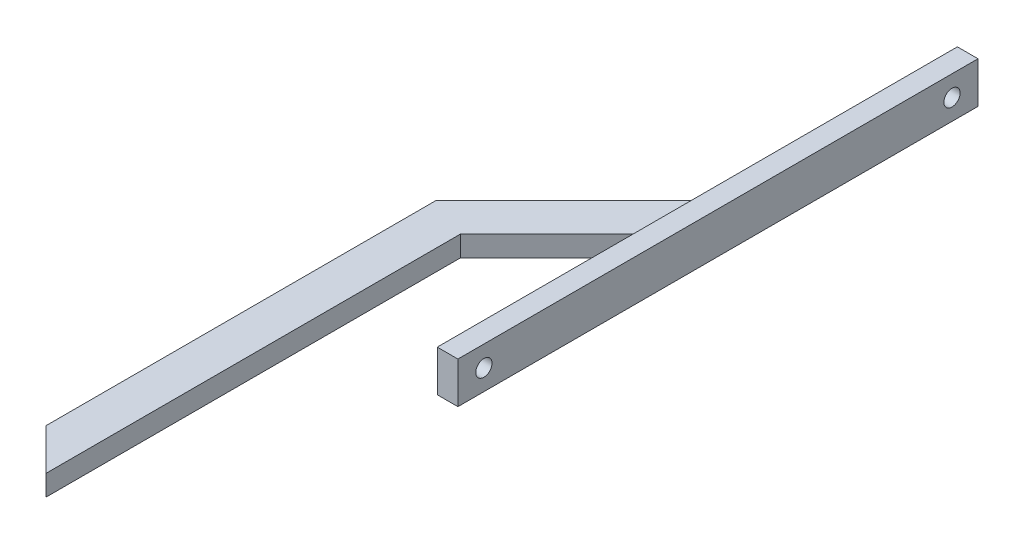
ISO-10303-21;
HEADER;
FILE_DESCRIPTION(('STEP AP214'),'2;1');
FILE_NAME('part.step','',(''),(''),'','','');
FILE_SCHEMA(('AUTOMOTIVE_DESIGN { 1 0 10303 214 1 1 1 1 }'));
ENDSEC;
DATA;
#1=APPLICATION_CONTEXT('core data for automotive mechanical design processes');
#2=APPLICATION_PROTOCOL_DEFINITION('international standard','automotive_design',2000,#1);
#3=PRODUCT_CONTEXT('',#1,'mechanical');
#4=PRODUCT('Part','Part','',(#3));
#5=PRODUCT_RELATED_PRODUCT_CATEGORY('part','',(#4));
#6=PRODUCT_DEFINITION_FORMATION('','',#4);
#7=PRODUCT_DEFINITION_CONTEXT('part definition',#1,'design');
#8=PRODUCT_DEFINITION('design','',#6,#7);
#9=PRODUCT_DEFINITION_SHAPE('','',#8);
#10=(LENGTH_UNIT() NAMED_UNIT(*) SI_UNIT(.MILLI.,.METRE.));
#11=(NAMED_UNIT(*) PLANE_ANGLE_UNIT() SI_UNIT($,.RADIAN.));
#12=(NAMED_UNIT(*) SI_UNIT($,.STERADIAN.) SOLID_ANGLE_UNIT());
#13=UNCERTAINTY_MEASURE_WITH_UNIT(LENGTH_MEASURE(1.E-05),#10,'distance_accuracy_value','');
#14=(GEOMETRIC_REPRESENTATION_CONTEXT(3) GLOBAL_UNCERTAINTY_ASSIGNED_CONTEXT((#13)) GLOBAL_UNIT_ASSIGNED_CONTEXT((#10,
#11,#12)) REPRESENTATION_CONTEXT('',''));
#15=CARTESIAN_POINT('',(0.,0.,0.));
#16=DIRECTION('',(0.,0.,1.));
#17=DIRECTION('',(1.,0.,0.));
#18=AXIS2_PLACEMENT_3D('',#15,#16,#17);
#19=CARTESIAN_POINT('',(3.175,-6.35,-80.));
#20=DIRECTION('',(1.,0.,0.));
#21=DIRECTION('',(0.,0.,-1.));
#22=AXIS2_PLACEMENT_3D('',#19,#20,#21);
#23=PLANE('',#22);
#24=CARTESIAN_POINT('',(3.175,0.,72.));
#25=DIRECTION('',(1.,0.,0.));
#26=DIRECTION('',(0.,0.,-1.));
#27=AXIS2_PLACEMENT_3D('',#24,#25,#26);
#28=CIRCLE('',#27,2.5);
#29=CARTESIAN_POINT('',(3.175,0.,69.5));
#30=VERTEX_POINT('',#29);
#31=EDGE_CURVE('E156',#30,#30,#28,.T.);
#32=ORIENTED_EDGE('',*,*,#31,.F.);
#33=EDGE_LOOP('',(#32));
#34=FACE_BOUND('',#33,.T.);
#35=CARTESIAN_POINT('',(3.175,0.,-72.));
#36=DIRECTION('',(1.,0.,0.));
#37=DIRECTION('',(0.,0.,1.));
#38=AXIS2_PLACEMENT_3D('',#35,#36,#37);
#39=CIRCLE('',#38,2.5);
#40=CARTESIAN_POINT('',(3.175,0.,-69.5));
#41=VERTEX_POINT('',#40);
#42=EDGE_CURVE('E164',#41,#41,#39,.T.);
#43=ORIENTED_EDGE('',*,*,#42,.F.);
#44=EDGE_LOOP('',(#43));
#45=FACE_BOUND('',#44,.T.);
#46=DIRECTION('',(0.,0.,1.));
#47=VECTOR('',#46,1.);
#48=CARTESIAN_POINT('',(3.175,6.35,-80.));
#49=LINE('',#48,#47);
#50=CARTESIAN_POINT('',(3.175,6.35,-80.));
#51=VERTEX_POINT('',#50);
#52=CARTESIAN_POINT('',(3.175,6.35,80.));
#53=VERTEX_POINT('',#52);
#54=EDGE_CURVE('E199',#51,#53,#49,.T.);
#55=ORIENTED_EDGE('',*,*,#54,.T.);
#56=DIRECTION('',(0.,1.,0.));
#57=VECTOR('',#56,1.);
#58=CARTESIAN_POINT('',(3.175,-6.35,80.));
#59=LINE('',#58,#57);
#60=CARTESIAN_POINT('',(3.175,-6.35,80.));
#61=VERTEX_POINT('',#60);
#62=EDGE_CURVE('E155',#61,#53,#59,.T.);
#63=ORIENTED_EDGE('',*,*,#62,.F.);
#64=DIRECTION('',(0.,0.,1.));
#65=VECTOR('',#64,1.);
#66=CARTESIAN_POINT('',(3.175,-6.35,-80.));
#67=LINE('',#66,#65);
#68=CARTESIAN_POINT('',(3.175,-6.35,-80.));
#69=VERTEX_POINT('',#68);
#70=EDGE_CURVE('E62',#69,#61,#67,.T.);
#71=ORIENTED_EDGE('',*,*,#70,.F.);
#72=DIRECTION('',(0.,1.,0.));
#73=VECTOR('',#72,1.);
#74=CARTESIAN_POINT('',(3.175,-6.35,-80.));
#75=LINE('',#74,#73);
#76=EDGE_CURVE('E184',#69,#51,#75,.T.);
#77=ORIENTED_EDGE('',*,*,#76,.T.);
#78=EDGE_LOOP('',(#55,#63,#71,#77));
#79=FACE_BOUND('',#78,.T.);
#80=ADVANCED_FACE('F39',(#34,#45,#79),#23,.T.);
#81=CARTESIAN_POINT('',(-3.175,-6.35,-80.));
#82=DIRECTION('',(0.,-1.,0.));
#83=DIRECTION('',(0.,0.,-1.));
#84=AXIS2_PLACEMENT_3D('',#81,#82,#83);
#85=PLANE('',#84);
#86=ORIENTED_EDGE('',*,*,#70,.T.);
#87=DIRECTION('',(1.,0.,0.));
#88=VECTOR('',#87,1.);
#89=CARTESIAN_POINT('',(-3.175,-6.35,80.));
#90=LINE('',#89,#88);
#91=CARTESIAN_POINT('',(-3.175,-6.35,80.));
#92=VERTEX_POINT('',#91);
#93=EDGE_CURVE('E180',#92,#61,#90,.T.);
#94=ORIENTED_EDGE('',*,*,#93,.F.);
#95=DIRECTION('',(0.,0.,1.));
#96=VECTOR('',#95,1.);
#97=CARTESIAN_POINT('',(-3.175,-6.35,-80.));
#98=LINE('',#97,#96);
#99=CARTESIAN_POINT('',(-3.175,-6.35,-80.));
#100=VERTEX_POINT('',#99);
#101=EDGE_CURVE('E202',#100,#92,#98,.T.);
#102=ORIENTED_EDGE('',*,*,#101,.F.);
#103=DIRECTION('',(1.,0.,0.));
#104=VECTOR('',#103,1.);
#105=CARTESIAN_POINT('',(-3.175,-6.35,-80.));
#106=LINE('',#105,#104);
#107=EDGE_CURVE('E195',#100,#69,#106,.T.);
#108=ORIENTED_EDGE('',*,*,#107,.T.);
#109=EDGE_LOOP('',(#86,#94,#102,#108));
#110=FACE_BOUND('',#109,.T.);
#111=ADVANCED_FACE('F266',(#110),#85,.T.);
#112=CARTESIAN_POINT('',(-3.175,-6.35,-80.));
#113=DIRECTION('',(-1.,0.,0.));
#114=DIRECTION('',(0.,0.,1.));
#115=AXIS2_PLACEMENT_3D('',#112,#113,#114);
#116=PLANE('',#115);
#117=DIRECTION('',(0.,0.,1.));
#118=VECTOR('',#117,1.);
#119=CARTESIAN_POINT('',(-3.175,-3.175,-80.));
#120=LINE('',#119,#118);
#121=CARTESIAN_POINT('',(-3.175,-3.175,-4.49012806053455));
#122=VERTEX_POINT('',#121);
#123=CARTESIAN_POINT('',(-3.175,-3.175,13.4703841816038));
#124=VERTEX_POINT('',#123);
#125=EDGE_CURVE('E11',#122,#124,#120,.T.);
#126=ORIENTED_EDGE('',*,*,#125,.F.);
#127=DIRECTION('',(0.,1.,0.));
#128=VECTOR('',#127,1.);
#129=CARTESIAN_POINT('',(-3.175,-3.175,-4.49012806053455));
#130=LINE('',#129,#128);
#131=CARTESIAN_POINT('',(-3.175,3.175,-4.49012806053455));
#132=VERTEX_POINT('',#131);
#133=EDGE_CURVE('E130',#122,#132,#130,.T.);
#134=ORIENTED_EDGE('',*,*,#133,.T.);
#135=DIRECTION('',(0.,0.,1.));
#136=VECTOR('',#135,1.);
#137=CARTESIAN_POINT('',(-3.175,3.175,-80.));
#138=LINE('',#137,#136);
#139=CARTESIAN_POINT('',(-3.175,3.175,13.4703841816038));
#140=VERTEX_POINT('',#139);
#141=EDGE_CURVE('E116',#132,#140,#138,.T.);
#142=ORIENTED_EDGE('',*,*,#141,.T.);
#143=DIRECTION('',(0.,1.,0.));
#144=VECTOR('',#143,1.);
#145=CARTESIAN_POINT('',(-3.175,-6.35,13.4703841816038));
#146=LINE('',#145,#144);
#147=EDGE_CURVE('E47',#124,#140,#146,.T.);
#148=ORIENTED_EDGE('',*,*,#147,.F.);
#149=EDGE_LOOP('',(#126,#134,#142,#148));
#150=FACE_BOUND('',#149,.T.);
#151=CARTESIAN_POINT('',(-3.175,0.,72.));
#152=DIRECTION('',(1.,0.,0.));
#153=DIRECTION('',(0.,0.,-1.));
#154=AXIS2_PLACEMENT_3D('',#151,#152,#153);
#155=CIRCLE('',#154,2.5);
#156=CARTESIAN_POINT('',(-3.175,0.,69.5));
#157=VERTEX_POINT('',#156);
#158=EDGE_CURVE('E151',#157,#157,#155,.T.);
#159=ORIENTED_EDGE('',*,*,#158,.T.);
#160=EDGE_LOOP('',(#159));
#161=FACE_BOUND('',#160,.T.);
#162=CARTESIAN_POINT('',(-3.175,0.,-72.));
#163=DIRECTION('',(1.,0.,0.));
#164=DIRECTION('',(0.,0.,1.));
#165=AXIS2_PLACEMENT_3D('',#162,#163,#164);
#166=CIRCLE('',#165,2.5);
#167=CARTESIAN_POINT('',(-3.175,0.,-69.5));
#168=VERTEX_POINT('',#167);
#169=EDGE_CURVE('E160',#168,#168,#166,.T.);
#170=ORIENTED_EDGE('',*,*,#169,.T.);
#171=EDGE_LOOP('',(#170));
#172=FACE_BOUND('',#171,.T.);
#173=ORIENTED_EDGE('',*,*,#101,.T.);
#174=DIRECTION('',(0.,-1.,0.));
#175=VECTOR('',#174,1.);
#176=CARTESIAN_POINT('',(-3.175,-6.35,80.));
#177=LINE('',#176,#175);
#178=CARTESIAN_POINT('',(-3.175,6.35,80.));
#179=VERTEX_POINT('',#178);
#180=EDGE_CURVE('E176',#179,#92,#177,.T.);
#181=ORIENTED_EDGE('',*,*,#180,.F.);
#182=DIRECTION('',(0.,0.,1.));
#183=VECTOR('',#182,1.);
#184=CARTESIAN_POINT('',(-3.175,6.35,-80.));
#185=LINE('',#184,#183);
#186=CARTESIAN_POINT('',(-3.175,6.35,-80.));
#187=VERTEX_POINT('',#186);
#188=EDGE_CURVE('E205',#187,#179,#185,.T.);
#189=ORIENTED_EDGE('',*,*,#188,.F.);
#190=DIRECTION('',(0.,-1.,0.));
#191=VECTOR('',#190,1.);
#192=CARTESIAN_POINT('',(-3.175,-6.35,-80.));
#193=LINE('',#192,#191);
#194=EDGE_CURVE('E191',#187,#100,#193,.T.);
#195=ORIENTED_EDGE('',*,*,#194,.T.);
#196=EDGE_LOOP('',(#173,#181,#189,#195));
#197=FACE_BOUND('',#196,.T.);
#198=ADVANCED_FACE('F137',(#150,#161,#172,#197),#116,.T.);
#199=CARTESIAN_POINT('',(-3.175,6.35,-80.));
#200=DIRECTION('',(0.,1.,0.));
#201=DIRECTION('',(0.,0.,1.));
#202=AXIS2_PLACEMENT_3D('',#199,#200,#201);
#203=PLANE('',#202);
#204=ORIENTED_EDGE('',*,*,#188,.T.);
#205=DIRECTION('',(-1.,0.,0.));
#206=VECTOR('',#205,1.);
#207=CARTESIAN_POINT('',(-3.175,6.35,80.));
#208=LINE('',#207,#206);
#209=EDGE_CURVE('E172',#53,#179,#208,.T.);
#210=ORIENTED_EDGE('',*,*,#209,.F.);
#211=ORIENTED_EDGE('',*,*,#54,.F.);
#212=DIRECTION('',(-1.,0.,0.));
#213=VECTOR('',#212,1.);
#214=CARTESIAN_POINT('',(-3.175,6.35,-80.));
#215=LINE('',#214,#213);
#216=EDGE_CURVE('E187',#51,#187,#215,.T.);
#217=ORIENTED_EDGE('',*,*,#216,.T.);
#218=EDGE_LOOP('',(#204,#210,#211,#217));
#219=FACE_BOUND('',#218,.T.);
#220=ADVANCED_FACE('F279',(#219),#203,.T.);
#221=CARTESIAN_POINT('',(0.,0.,-80.));
#222=DIRECTION('',(0.,0.,-1.));
#223=DIRECTION('',(-1.,0.,0.));
#224=AXIS2_PLACEMENT_3D('',#221,#222,#223);
#225=PLANE('',#224);
#226=ORIENTED_EDGE('',*,*,#76,.F.);
#227=ORIENTED_EDGE('',*,*,#107,.F.);
#228=ORIENTED_EDGE('',*,*,#194,.F.);
#229=ORIENTED_EDGE('',*,*,#216,.F.);
#230=EDGE_LOOP('',(#226,#227,#228,#229));
#231=FACE_BOUND('',#230,.T.);
#232=ADVANCED_FACE('F287',(#231),#225,.T.);
#233=CARTESIAN_POINT('',(0.,0.,80.));
#234=DIRECTION('',(0.,0.,-1.));
#235=DIRECTION('',(-1.,0.,0.));
#236=AXIS2_PLACEMENT_3D('',#233,#234,#235);
#237=PLANE('',#236);
#238=ORIENTED_EDGE('',*,*,#62,.T.);
#239=ORIENTED_EDGE('',*,*,#209,.T.);
#240=ORIENTED_EDGE('',*,*,#180,.T.);
#241=ORIENTED_EDGE('',*,*,#93,.T.);
#242=EDGE_LOOP('',(#238,#239,#240,#241));
#243=FACE_BOUND('',#242,.T.);
#244=ADVANCED_FACE('F282',(#243),#237,.F.);
#245=CARTESIAN_POINT('',(-3.175,0.,-72.));
#246=DIRECTION('',(1.,0.,0.));
#247=DIRECTION('',(0.,0.,-1.));
#248=AXIS2_PLACEMENT_3D('',#245,#246,#247);
#249=CYLINDRICAL_SURFACE('',#248,2.5);
#250=ORIENTED_EDGE('',*,*,#169,.F.);
#251=EDGE_LOOP('',(#250));
#252=FACE_BOUND('',#251,.T.);
#253=ORIENTED_EDGE('',*,*,#42,.T.);
#254=EDGE_LOOP('',(#253));
#255=FACE_BOUND('',#254,.T.);
#256=ADVANCED_FACE('F299',(#252,#255),#249,.F.);
#257=CARTESIAN_POINT('',(-3.175,0.,72.));
#258=DIRECTION('',(1.,0.,0.));
#259=DIRECTION('',(0.,0.,-1.));
#260=AXIS2_PLACEMENT_3D('',#257,#258,#259);
#261=CYLINDRICAL_SURFACE('',#260,2.5);
#262=ORIENTED_EDGE('',*,*,#158,.F.);
#263=EDGE_LOOP('',(#262));
#264=FACE_BOUND('',#263,.T.);
#265=ORIENTED_EDGE('',*,*,#31,.T.);
#266=EDGE_LOOP('',(#265));
#267=FACE_BOUND('',#266,.T.);
#268=ADVANCED_FACE('F302',(#264,#267),#261,.F.);
#269=CARTESIAN_POINT('',(3.175,-3.175,7.12038418160378));
#270=DIRECTION('',(0.707106781186551,0.,0.707106781186544));
#271=DIRECTION('',(0.707106781186544,0.,-0.707106781186551));
#272=AXIS2_PLACEMENT_3D('',#269,#270,#271);
#273=PLANE('',#272);
#274=DIRECTION('',(0.707106781186544,0.,-0.707106781186551));
#275=VECTOR('',#274,1.);
#276=CARTESIAN_POINT('',(3.175,-3.175,7.12038418160378));
#277=LINE('',#276,#275);
#278=CARTESIAN_POINT('',(-32.9014068711926,-3.175,43.1967910527968));
#279=VERTEX_POINT('',#278);
#280=EDGE_CURVE('E140',#279,#124,#277,.T.);
#281=ORIENTED_EDGE('',*,*,#280,.T.);
#282=ORIENTED_EDGE('',*,*,#147,.T.);
#283=DIRECTION('',(0.707106781186544,0.,-0.707106781186551));
#284=VECTOR('',#283,1.);
#285=CARTESIAN_POINT('',(3.175,3.175,7.12038418160378));
#286=LINE('',#285,#284);
#287=CARTESIAN_POINT('',(-32.9014068711926,3.175,43.1967910527968));
#288=VERTEX_POINT('',#287);
#289=EDGE_CURVE('E54',#288,#140,#286,.T.);
#290=ORIENTED_EDGE('',*,*,#289,.F.);
#291=DIRECTION('',(0.,1.,0.));
#292=VECTOR('',#291,1.);
#293=CARTESIAN_POINT('',(-32.9014068711926,-3.175,43.1967910527968));
#294=LINE('',#293,#292);
#295=EDGE_CURVE('E168',#279,#288,#294,.T.);
#296=ORIENTED_EDGE('',*,*,#295,.F.);
#297=EDGE_LOOP('',(#281,#282,#290,#296));
#298=FACE_BOUND('',#297,.T.);
#299=ADVANCED_FACE('F211',(#298),#273,.T.);
#300=CARTESIAN_POINT('',(-32.9014068711926,-3.175,170.636278810659));
#301=DIRECTION('',(1.,0.,0.));
#302=DIRECTION('',(0.,0.,-1.));
#303=AXIS2_PLACEMENT_3D('',#300,#301,#302);
#304=PLANE('',#303);
#305=ORIENTED_EDGE('',*,*,#295,.T.);
#306=DIRECTION('',(0.,0.,-1.));
#307=VECTOR('',#306,1.);
#308=CARTESIAN_POINT('',(-32.9014068711926,3.175,170.636278810659));
#309=LINE('',#308,#307);
#310=CARTESIAN_POINT('',(-32.9014068711926,3.175,170.636278810659));
#311=VERTEX_POINT('',#310);
#312=EDGE_CURVE('E247',#311,#288,#309,.T.);
#313=ORIENTED_EDGE('',*,*,#312,.F.);
#314=DIRECTION('',(0.,1.,0.));
#315=VECTOR('',#314,1.);
#316=CARTESIAN_POINT('',(-32.9014068711926,-3.175,170.636278810659));
#317=LINE('',#316,#315);
#318=CARTESIAN_POINT('',(-32.9014068711926,-3.175,170.636278810659));
#319=VERTEX_POINT('',#318);
#320=EDGE_CURVE('E222',#319,#311,#317,.T.);
#321=ORIENTED_EDGE('',*,*,#320,.F.);
#322=DIRECTION('',(0.,0.,-1.));
#323=VECTOR('',#322,1.);
#324=CARTESIAN_POINT('',(-32.9014068711926,-3.175,170.636278810659));
#325=LINE('',#324,#323);
#326=EDGE_CURVE('E147',#319,#279,#325,.T.);
#327=ORIENTED_EDGE('',*,*,#326,.T.);
#328=EDGE_LOOP('',(#305,#313,#321,#327));
#329=FACE_BOUND('',#328,.T.);
#330=ADVANCED_FACE('F220',(#329),#304,.T.);
#331=CARTESIAN_POINT('',(-45.6014068711926,-3.175,157.936278810659));
#332=DIRECTION('',(-0.707106781186551,0.,0.707106781186544));
#333=DIRECTION('',(0.707106781186544,0.,0.707106781186551));
#334=AXIS2_PLACEMENT_3D('',#331,#332,#333);
#335=PLANE('',#334);
#336=ORIENTED_EDGE('',*,*,#320,.T.);
#337=DIRECTION('',(0.707106781186544,0.,0.707106781186551));
#338=VECTOR('',#337,1.);
#339=CARTESIAN_POINT('',(-45.6014068711926,3.175,157.936278810659));
#340=LINE('',#339,#338);
#341=CARTESIAN_POINT('',(-45.6014068711926,3.175,157.936278810659));
#342=VERTEX_POINT('',#341);
#343=EDGE_CURVE('E242',#342,#311,#340,.T.);
#344=ORIENTED_EDGE('',*,*,#343,.F.);
#345=DIRECTION('',(0.,1.,0.));
#346=VECTOR('',#345,1.);
#347=CARTESIAN_POINT('',(-45.6014068711926,-3.175,157.936278810659));
#348=LINE('',#347,#346);
#349=CARTESIAN_POINT('',(-45.6014068711926,-3.175,157.936278810659));
#350=VERTEX_POINT('',#349);
#351=EDGE_CURVE('E144',#350,#342,#348,.T.);
#352=ORIENTED_EDGE('',*,*,#351,.F.);
#353=DIRECTION('',(0.707106781186544,0.,0.707106781186551));
#354=VECTOR('',#353,1.);
#355=CARTESIAN_POINT('',(-45.6014068711926,-3.175,157.936278810659));
#356=LINE('',#355,#354);
#357=EDGE_CURVE('E224',#350,#319,#356,.T.);
#358=ORIENTED_EDGE('',*,*,#357,.T.);
#359=EDGE_LOOP('',(#336,#344,#352,#358));
#360=FACE_BOUND('',#359,.T.);
#361=ADVANCED_FACE('F245',(#360),#335,.T.);
#362=CARTESIAN_POINT('',(-45.6014068711926,-3.175,37.9362788106585));
#363=DIRECTION('',(-1.,0.,0.));
#364=DIRECTION('',(0.,0.,1.));
#365=AXIS2_PLACEMENT_3D('',#362,#363,#364);
#366=PLANE('',#365);
#367=ORIENTED_EDGE('',*,*,#351,.T.);
#368=DIRECTION('',(0.,0.,1.));
#369=VECTOR('',#368,1.);
#370=CARTESIAN_POINT('',(-45.6014068711926,3.175,37.9362788106585));
#371=LINE('',#370,#369);
#372=CARTESIAN_POINT('',(-45.6014068711926,3.175,37.9362788106585));
#373=VERTEX_POINT('',#372);
#374=EDGE_CURVE('E134',#373,#342,#371,.T.);
#375=ORIENTED_EDGE('',*,*,#374,.F.);
#376=DIRECTION('',(0.,1.,0.));
#377=VECTOR('',#376,1.);
#378=CARTESIAN_POINT('',(-45.6014068711926,-3.175,37.9362788106585));
#379=LINE('',#378,#377);
#380=CARTESIAN_POINT('',(-45.6014068711926,-3.175,37.9362788106585));
#381=VERTEX_POINT('',#380);
#382=EDGE_CURVE('E132',#381,#373,#379,.T.);
#383=ORIENTED_EDGE('',*,*,#382,.F.);
#384=DIRECTION('',(0.,0.,1.));
#385=VECTOR('',#384,1.);
#386=CARTESIAN_POINT('',(-45.6014068711926,-3.175,37.9362788106585));
#387=LINE('',#386,#385);
#388=EDGE_CURVE('E227',#381,#350,#387,.T.);
#389=ORIENTED_EDGE('',*,*,#388,.T.);
#390=EDGE_LOOP('',(#367,#375,#383,#389));
#391=FACE_BOUND('',#390,.T.);
#392=ADVANCED_FACE('F237',(#391),#366,.T.);
#393=CARTESIAN_POINT('',(-3.175,-3.175,-4.49012806053455));
#394=DIRECTION('',(-0.707106781186552,0.,-0.707106781186543));
#395=DIRECTION('',(-0.707106781186543,0.,0.707106781186552));
#396=AXIS2_PLACEMENT_3D('',#393,#394,#395);
#397=PLANE('',#396);
#398=ORIENTED_EDGE('',*,*,#382,.T.);
#399=DIRECTION('',(-0.707106781186543,0.,0.707106781186552));
#400=VECTOR('',#399,1.);
#401=CARTESIAN_POINT('',(-3.175,3.175,-4.49012806053455));
#402=LINE('',#401,#400);
#403=EDGE_CURVE('E120',#132,#373,#402,.T.);
#404=ORIENTED_EDGE('',*,*,#403,.F.);
#405=ORIENTED_EDGE('',*,*,#133,.F.);
#406=DIRECTION('',(-0.707106781186543,0.,0.707106781186552));
#407=VECTOR('',#406,1.);
#408=CARTESIAN_POINT('',(-3.175,-3.175,-4.49012806053455));
#409=LINE('',#408,#407);
#410=EDGE_CURVE('E254',#122,#381,#409,.T.);
#411=ORIENTED_EDGE('',*,*,#410,.T.);
#412=EDGE_LOOP('',(#398,#404,#405,#411));
#413=FACE_BOUND('',#412,.T.);
#414=ADVANCED_FACE('F128',(#413),#397,.T.);
#415=CARTESIAN_POINT('',(0.,-3.175,0.));
#416=DIRECTION('',(0.,-1.,0.));
#417=DIRECTION('',(0.,0.,-1.));
#418=AXIS2_PLACEMENT_3D('',#415,#416,#417);
#419=PLANE('',#418);
#420=ORIENTED_EDGE('',*,*,#410,.F.);
#421=ORIENTED_EDGE('',*,*,#125,.T.);
#422=ORIENTED_EDGE('',*,*,#280,.F.);
#423=ORIENTED_EDGE('',*,*,#326,.F.);
#424=ORIENTED_EDGE('',*,*,#357,.F.);
#425=ORIENTED_EDGE('',*,*,#388,.F.);
#426=EDGE_LOOP('',(#420,#421,#422,#423,#424,#425));
#427=FACE_BOUND('',#426,.T.);
#428=ADVANCED_FACE('F216',(#427),#419,.T.);
#429=CARTESIAN_POINT('',(0.,3.175,0.));
#430=DIRECTION('',(0.,-1.,0.));
#431=DIRECTION('',(0.,0.,-1.));
#432=AXIS2_PLACEMENT_3D('',#429,#430,#431);
#433=PLANE('',#432);
#434=ORIENTED_EDGE('',*,*,#141,.F.);
#435=ORIENTED_EDGE('',*,*,#403,.T.);
#436=ORIENTED_EDGE('',*,*,#374,.T.);
#437=ORIENTED_EDGE('',*,*,#343,.T.);
#438=ORIENTED_EDGE('',*,*,#312,.T.);
#439=ORIENTED_EDGE('',*,*,#289,.T.);
#440=EDGE_LOOP('',(#434,#435,#436,#437,#438,#439));
#441=FACE_BOUND('',#440,.T.);
#442=ADVANCED_FACE('F118',(#441),#433,.F.);
#443=CLOSED_SHELL('',(#80,#111,#198,#220,#232,#244,#256,#268,#299,#330,#361,#392,#414,#428,#442));
#444=MANIFOLD_SOLID_BREP('B2',#443);
#445=ADVANCED_BREP_SHAPE_REPRESENTATION('',(#18,#444),#14);
#446=SHAPE_DEFINITION_REPRESENTATION(#9,#445);
ENDSEC;
END-ISO-10303-21;
